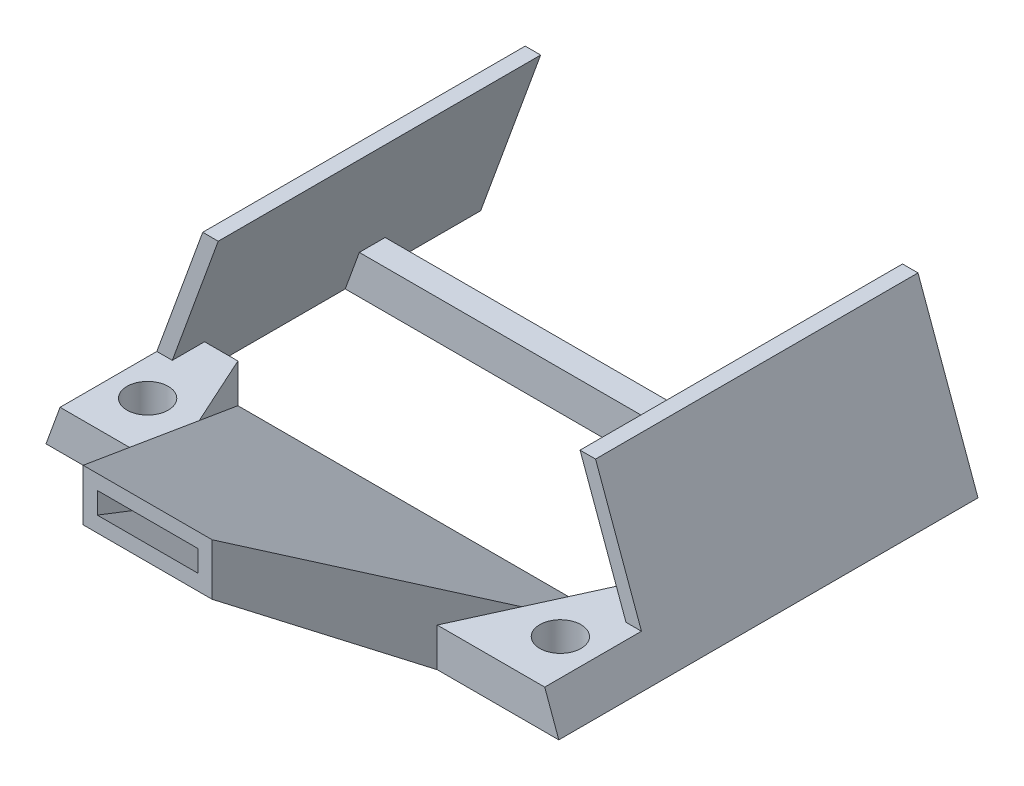
ISO-10303-21;
HEADER;
FILE_DESCRIPTION(('STEP AP214'),'2;1');
FILE_NAME('part.step','',(''),(''),'','','');
FILE_SCHEMA(('AUTOMOTIVE_DESIGN { 1 0 10303 214 1 1 1 1 }'));
ENDSEC;
DATA;
#1=APPLICATION_CONTEXT('core data for automotive mechanical design processes');
#2=APPLICATION_PROTOCOL_DEFINITION('international standard','automotive_design',2000,#1);
#3=PRODUCT_CONTEXT('',#1,'mechanical');
#4=PRODUCT('Part','Part','',(#3));
#5=PRODUCT_RELATED_PRODUCT_CATEGORY('part','',(#4));
#6=PRODUCT_DEFINITION_FORMATION('','',#4);
#7=PRODUCT_DEFINITION_CONTEXT('part definition',#1,'design');
#8=PRODUCT_DEFINITION('design','',#6,#7);
#9=PRODUCT_DEFINITION_SHAPE('','',#8);
#10=(LENGTH_UNIT() NAMED_UNIT(*) SI_UNIT(.MILLI.,.METRE.));
#11=(NAMED_UNIT(*) PLANE_ANGLE_UNIT() SI_UNIT($,.RADIAN.));
#12=(NAMED_UNIT(*) SI_UNIT($,.STERADIAN.) SOLID_ANGLE_UNIT());
#13=UNCERTAINTY_MEASURE_WITH_UNIT(LENGTH_MEASURE(1.E-05),#10,'distance_accuracy_value','');
#14=(GEOMETRIC_REPRESENTATION_CONTEXT(3) GLOBAL_UNCERTAINTY_ASSIGNED_CONTEXT((#13)) GLOBAL_UNIT_ASSIGNED_CONTEXT((#10,
#11,#12)) REPRESENTATION_CONTEXT('',''));
#15=CARTESIAN_POINT('',(0.,0.,0.));
#16=DIRECTION('',(0.,0.,1.));
#17=DIRECTION('',(1.,0.,0.));
#18=AXIS2_PLACEMENT_3D('',#15,#16,#17);
#19=CARTESIAN_POINT('',(-14.0264257375947,12.7805113490033,12.5));
#20=DIRECTION('',(-0.939692620785907,0.342020143325673,0.));
#21=DIRECTION('',(-0.342020143325673,-0.939692620785907,0.));
#22=AXIS2_PLACEMENT_3D('',#19,#20,#21);
#23=PLANE('',#22);
#24=DIRECTION('',(-0.342020143325673,-0.939692620785907,0.));
#25=VECTOR('',#24,1.);
#26=CARTESIAN_POINT('',(-14.0264257375947,12.7805113490033,-2.));
#27=LINE('',#26,#25);
#28=CARTESIAN_POINT('',(-17.5862407445347,3.,-2.));
#29=VERTEX_POINT('',#28);
#30=CARTESIAN_POINT('',(-18.6781514473333,0.,-2.));
#31=VERTEX_POINT('',#30);
#32=EDGE_CURVE('E485',#29,#31,#27,.T.);
#33=ORIENTED_EDGE('',*,*,#32,.F.);
#34=DIRECTION('',(0.,0.,-1.));
#35=VECTOR('',#34,1.);
#36=CARTESIAN_POINT('',(-17.5862407445347,3.,12.5));
#37=LINE('',#36,#35);
#38=CARTESIAN_POINT('',(-17.5862407445347,3.,-4.));
#39=VERTEX_POINT('',#38);
#40=EDGE_CURVE('E473',#29,#39,#37,.T.);
#41=ORIENTED_EDGE('',*,*,#40,.T.);
#42=DIRECTION('',(0.342020143325673,0.939692620785907,0.));
#43=VECTOR('',#42,1.);
#44=CARTESIAN_POINT('',(-14.0264257375947,12.7805113490033,-4.));
#45=LINE('',#44,#43);
#46=CARTESIAN_POINT('',(-18.6781514473333,0.,-4.));
#47=VERTEX_POINT('',#46);
#48=EDGE_CURVE('E501',#47,#39,#45,.T.);
#49=ORIENTED_EDGE('',*,*,#48,.F.);
#50=DIRECTION('',(0.,0.,-1.));
#51=VECTOR('',#50,1.);
#52=CARTESIAN_POINT('',(-18.6781514473333,0.,12.5));
#53=LINE('',#52,#51);
#54=CARTESIAN_POINT('',(-18.6781514473333,0.,-12.5));
#55=VERTEX_POINT('',#54);
#56=EDGE_CURVE('E381',#47,#55,#53,.T.);
#57=ORIENTED_EDGE('',*,*,#56,.T.);
#58=DIRECTION('',(0.342020143325673,0.939692620785907,0.));
#59=VECTOR('',#58,1.);
#60=CARTESIAN_POINT('',(-14.0264257375947,12.7805113490033,-12.5));
#61=LINE('',#60,#59);
#62=CARTESIAN_POINT('',(-14.0264257375947,12.7805113490033,-12.5));
#63=VERTEX_POINT('',#62);
#64=EDGE_CURVE('E369',#55,#63,#61,.T.);
#65=ORIENTED_EDGE('',*,*,#64,.T.);
#66=DIRECTION('',(0.,0.,-1.));
#67=VECTOR('',#66,1.);
#68=CARTESIAN_POINT('',(-14.0264257375947,12.7805113490033,12.5));
#69=LINE('',#68,#67);
#70=CARTESIAN_POINT('',(-14.0264257375947,12.7805113490033,12.5));
#71=VERTEX_POINT('',#70);
#72=EDGE_CURVE('E378',#71,#63,#69,.T.);
#73=ORIENTED_EDGE('',*,*,#72,.F.);
#74=DIRECTION('',(0.342020143325673,0.939692620785907,0.));
#75=VECTOR('',#74,1.);
#76=CARTESIAN_POINT('',(-14.0264257375947,12.7805113490033,12.5));
#77=LINE('',#76,#75);
#78=CARTESIAN_POINT('',(-17.5862407445347,3.,12.5));
#79=VERTEX_POINT('',#78);
#80=EDGE_CURVE('E360',#79,#71,#77,.T.);
#81=ORIENTED_EDGE('',*,*,#80,.F.);
#82=DIRECTION('',(0.,0.,-1.));
#83=VECTOR('',#82,1.);
#84=CARTESIAN_POINT('',(-17.5862407445347,3.,0.));
#85=LINE('',#84,#83);
#86=CARTESIAN_POINT('',(-17.5862407445347,3.,9.99999999999999));
#87=VERTEX_POINT('',#86);
#88=EDGE_CURVE('E384',#79,#87,#85,.T.);
#89=ORIENTED_EDGE('',*,*,#88,.T.);
#90=DIRECTION('',(-0.342020143325673,-0.939692620785907,0.));
#91=VECTOR('',#90,1.);
#92=CARTESIAN_POINT('',(-17.8685969399293,2.22423272891034,9.99999999999999));
#93=LINE('',#92,#91);
#94=CARTESIAN_POINT('',(-18.6781514473333,0.,9.99999999999999));
#95=VERTEX_POINT('',#94);
#96=EDGE_CURVE('E313',#87,#95,#93,.T.);
#97=ORIENTED_EDGE('',*,*,#96,.T.);
#98=EDGE_CURVE('E382',#95,#31,#53,.T.);
#99=ORIENTED_EDGE('',*,*,#98,.T.);
#100=EDGE_LOOP('',(#33,#41,#49,#57,#65,#73,#81,#89,#97,#99));
#101=FACE_BOUND('',#100,.T.);
#102=ADVANCED_FACE('F35',(#101),#23,.F.);
#103=CARTESIAN_POINT('',(-19.8781514473333,0.,12.5));
#104=DIRECTION('',(0.939692620785907,-0.342020143325673,0.));
#105=DIRECTION('',(0.342020143325673,0.939692620785907,0.));
#106=AXIS2_PLACEMENT_3D('',#103,#104,#105);
#107=PLANE('',#106);
#108=DIRECTION('',(0.,0.,-1.));
#109=VECTOR('',#108,1.);
#110=CARTESIAN_POINT('',(-18.7862407445347,3.,48.5));
#111=LINE('',#110,#109);
#112=CARTESIAN_POINT('',(-18.7862407445347,3.,20.));
#113=VERTEX_POINT('',#112);
#114=CARTESIAN_POINT('',(-18.7862407445347,3.,12.5));
#115=VERTEX_POINT('',#114);
#116=EDGE_CURVE('E216',#113,#115,#111,.T.);
#117=ORIENTED_EDGE('',*,*,#116,.T.);
#118=DIRECTION('',(-0.342020143325673,-0.939692620785907,0.));
#119=VECTOR('',#118,1.);
#120=CARTESIAN_POINT('',(-19.8781514473333,0.,12.5));
#121=LINE('',#120,#119);
#122=CARTESIAN_POINT('',(-15.2264257375947,12.7805113490033,12.5));
#123=VERTEX_POINT('',#122);
#124=EDGE_CURVE('E365',#123,#115,#121,.T.);
#125=ORIENTED_EDGE('',*,*,#124,.F.);
#126=DIRECTION('',(0.,0.,-1.));
#127=VECTOR('',#126,1.);
#128=CARTESIAN_POINT('',(-15.2264257375947,12.7805113490033,12.5));
#129=LINE('',#128,#127);
#130=CARTESIAN_POINT('',(-15.2264257375947,12.7805113490033,-12.5));
#131=VERTEX_POINT('',#130);
#132=EDGE_CURVE('E375',#123,#131,#129,.T.);
#133=ORIENTED_EDGE('',*,*,#132,.T.);
#134=DIRECTION('',(-0.342020143325673,-0.939692620785907,0.));
#135=VECTOR('',#134,1.);
#136=CARTESIAN_POINT('',(-19.8781514473333,0.,-12.5));
#137=LINE('',#136,#135);
#138=CARTESIAN_POINT('',(-19.8781514473333,0.,-12.5));
#139=VERTEX_POINT('',#138);
#140=EDGE_CURVE('E363',#131,#139,#137,.T.);
#141=ORIENTED_EDGE('',*,*,#140,.T.);
#142=DIRECTION('',(0.,0.,-1.));
#143=VECTOR('',#142,1.);
#144=CARTESIAN_POINT('',(-19.8781514473333,0.,12.5));
#145=LINE('',#144,#143);
#146=CARTESIAN_POINT('',(-19.8781514473333,0.,20.));
#147=VERTEX_POINT('',#146);
#148=EDGE_CURVE('E50',#147,#139,#145,.T.);
#149=ORIENTED_EDGE('',*,*,#148,.F.);
#150=DIRECTION('',(-0.342020143325672,-0.939692620785907,0.));
#151=VECTOR('',#150,1.);
#152=CARTESIAN_POINT('',(-17.8116175388685,5.67775525004441,20.));
#153=LINE('',#152,#151);
#154=EDGE_CURVE('E212',#113,#147,#153,.T.);
#155=ORIENTED_EDGE('',*,*,#154,.F.);
#156=EDGE_LOOP('',(#117,#125,#133,#141,#149,#155));
#157=FACE_BOUND('',#156,.T.);
#158=ADVANCED_FACE('F214',(#157),#107,.F.);
#159=CARTESIAN_POINT('',(14.0264257375947,12.7805113490033,12.5));
#160=DIRECTION('',(0.939692620785907,0.342020143325673,0.));
#161=DIRECTION('',(-0.342020143325673,0.939692620785907,0.));
#162=AXIS2_PLACEMENT_3D('',#159,#160,#161);
#163=PLANE('',#162);
#164=DIRECTION('',(-0.342020143325673,0.939692620785907,0.));
#165=VECTOR('',#164,1.);
#166=CARTESIAN_POINT('',(14.0264257375947,12.7805113490033,-2.));
#167=LINE('',#166,#165);
#168=CARTESIAN_POINT('',(18.6781514473333,0.,-2.));
#169=VERTEX_POINT('',#168);
#170=CARTESIAN_POINT('',(17.5862407445347,3.,-2.));
#171=VERTEX_POINT('',#170);
#172=EDGE_CURVE('E486',#169,#171,#167,.T.);
#173=ORIENTED_EDGE('',*,*,#172,.F.);
#174=DIRECTION('',(0.,0.,-1.));
#175=VECTOR('',#174,1.);
#176=CARTESIAN_POINT('',(18.6781514473333,0.,12.5));
#177=LINE('',#176,#175);
#178=CARTESIAN_POINT('',(18.6781514473333,0.,9.99999999999999));
#179=VERTEX_POINT('',#178);
#180=EDGE_CURVE('E329',#179,#169,#177,.T.);
#181=ORIENTED_EDGE('',*,*,#180,.F.);
#182=DIRECTION('',(-0.342020143325673,0.939692620785907,0.));
#183=VECTOR('',#182,1.);
#184=CARTESIAN_POINT('',(17.8685969399293,2.22423272891034,9.99999999999999));
#185=LINE('',#184,#183);
#186=CARTESIAN_POINT('',(17.5862407445347,3.,9.99999999999999));
#187=VERTEX_POINT('',#186);
#188=EDGE_CURVE('E43',#179,#187,#185,.T.);
#189=ORIENTED_EDGE('',*,*,#188,.T.);
#190=DIRECTION('',(0.,0.,-1.));
#191=VECTOR('',#190,1.);
#192=CARTESIAN_POINT('',(17.5862407445347,3.,0.));
#193=LINE('',#192,#191);
#194=CARTESIAN_POINT('',(17.5862407445347,3.,12.5));
#195=VERTEX_POINT('',#194);
#196=EDGE_CURVE('E326',#195,#187,#193,.T.);
#197=ORIENTED_EDGE('',*,*,#196,.F.);
#198=DIRECTION('',(0.342020143325673,-0.939692620785907,0.));
#199=VECTOR('',#198,1.);
#200=CARTESIAN_POINT('',(14.0264257375947,12.7805113490033,12.5));
#201=LINE('',#200,#199);
#202=CARTESIAN_POINT('',(14.0264257375947,12.7805113490033,12.5));
#203=VERTEX_POINT('',#202);
#204=EDGE_CURVE('E506',#203,#195,#201,.T.);
#205=ORIENTED_EDGE('',*,*,#204,.F.);
#206=DIRECTION('',(0.,0.,-1.));
#207=VECTOR('',#206,1.);
#208=CARTESIAN_POINT('',(14.0264257375947,12.7805113490033,12.5));
#209=LINE('',#208,#207);
#210=CARTESIAN_POINT('',(14.0264257375947,12.7805113490033,-12.5));
#211=VERTEX_POINT('',#210);
#212=EDGE_CURVE('E513',#203,#211,#209,.T.);
#213=ORIENTED_EDGE('',*,*,#212,.T.);
#214=DIRECTION('',(0.342020143325673,-0.939692620785907,0.));
#215=VECTOR('',#214,1.);
#216=CARTESIAN_POINT('',(14.0264257375947,12.7805113490033,-12.5));
#217=LINE('',#216,#215);
#218=CARTESIAN_POINT('',(18.6781514473333,0.,-12.5));
#219=VERTEX_POINT('',#218);
#220=EDGE_CURVE('E505',#211,#219,#217,.T.);
#221=ORIENTED_EDGE('',*,*,#220,.T.);
#222=CARTESIAN_POINT('',(18.6781514473333,0.,-4.));
#223=VERTEX_POINT('',#222);
#224=EDGE_CURVE('E529',#223,#219,#177,.T.);
#225=ORIENTED_EDGE('',*,*,#224,.F.);
#226=DIRECTION('',(0.342020143325673,-0.939692620785907,0.));
#227=VECTOR('',#226,1.);
#228=CARTESIAN_POINT('',(14.0264257375947,12.7805113490033,-4.));
#229=LINE('',#228,#227);
#230=CARTESIAN_POINT('',(17.5862407445347,3.,-4.));
#231=VERTEX_POINT('',#230);
#232=EDGE_CURVE('E481',#231,#223,#229,.T.);
#233=ORIENTED_EDGE('',*,*,#232,.F.);
#234=DIRECTION('',(0.,0.,1.));
#235=VECTOR('',#234,1.);
#236=CARTESIAN_POINT('',(17.5862407445347,3.,12.5));
#237=LINE('',#236,#235);
#238=EDGE_CURVE('E482',#231,#171,#237,.T.);
#239=ORIENTED_EDGE('',*,*,#238,.T.);
#240=EDGE_LOOP('',(#173,#181,#189,#197,#205,#213,#221,#225,#233,#239));
#241=FACE_BOUND('',#240,.T.);
#242=ADVANCED_FACE('F324',(#241),#163,.F.);
#243=CARTESIAN_POINT('',(19.8781514473333,0.,12.5));
#244=DIRECTION('',(-0.939692620785907,-0.342020143325672,0.));
#245=DIRECTION('',(0.342020143325672,-0.939692620785907,0.));
#246=AXIS2_PLACEMENT_3D('',#243,#244,#245);
#247=PLANE('',#246);
#248=DIRECTION('',(-0.342020143325672,0.939692620785907,0.));
#249=VECTOR('',#248,1.);
#250=CARTESIAN_POINT('',(19.8781514473333,0.,-12.5));
#251=LINE('',#250,#249);
#252=CARTESIAN_POINT('',(19.8781514473333,0.,-12.5));
#253=VERTEX_POINT('',#252);
#254=CARTESIAN_POINT('',(15.2264257375947,12.7805113490033,-12.5));
#255=VERTEX_POINT('',#254);
#256=EDGE_CURVE('E519',#253,#255,#251,.T.);
#257=ORIENTED_EDGE('',*,*,#256,.T.);
#258=DIRECTION('',(0.,0.,-1.));
#259=VECTOR('',#258,1.);
#260=CARTESIAN_POINT('',(15.2264257375947,12.7805113490033,12.5));
#261=LINE('',#260,#259);
#262=CARTESIAN_POINT('',(15.2264257375947,12.7805113490033,12.5));
#263=VERTEX_POINT('',#262);
#264=EDGE_CURVE('E524',#263,#255,#261,.T.);
#265=ORIENTED_EDGE('',*,*,#264,.F.);
#266=DIRECTION('',(-0.342020143325672,0.939692620785907,0.));
#267=VECTOR('',#266,1.);
#268=CARTESIAN_POINT('',(19.8781514473333,0.,12.5));
#269=LINE('',#268,#267);
#270=CARTESIAN_POINT('',(18.7862407445347,3.,12.5));
#271=VERTEX_POINT('',#270);
#272=EDGE_CURVE('E508',#271,#263,#269,.T.);
#273=ORIENTED_EDGE('',*,*,#272,.F.);
#274=DIRECTION('',(0.,0.,-1.));
#275=VECTOR('',#274,1.);
#276=CARTESIAN_POINT('',(18.7862407445347,3.,48.5));
#277=LINE('',#276,#275);
#278=CARTESIAN_POINT('',(18.7862407445347,3.,20.));
#279=VERTEX_POINT('',#278);
#280=EDGE_CURVE('E58',#279,#271,#277,.T.);
#281=ORIENTED_EDGE('',*,*,#280,.F.);
#282=DIRECTION('',(-0.342020143325672,0.939692620785907,0.));
#283=VECTOR('',#282,1.);
#284=CARTESIAN_POINT('',(17.8116175388685,5.67775525004441,20.));
#285=LINE('',#284,#283);
#286=CARTESIAN_POINT('',(19.8781514473333,0.,20.));
#287=VERTEX_POINT('',#286);
#288=EDGE_CURVE('E494',#287,#279,#285,.T.);
#289=ORIENTED_EDGE('',*,*,#288,.F.);
#290=DIRECTION('',(0.,0.,-1.));
#291=VECTOR('',#290,1.);
#292=CARTESIAN_POINT('',(19.8781514473333,0.,12.5));
#293=LINE('',#292,#291);
#294=EDGE_CURVE('E527',#287,#253,#293,.T.);
#295=ORIENTED_EDGE('',*,*,#294,.T.);
#296=EDGE_LOOP('',(#257,#265,#273,#281,#289,#295));
#297=FACE_BOUND('',#296,.T.);
#298=ADVANCED_FACE('F436',(#297),#247,.F.);
#299=CARTESIAN_POINT('',(0.,3.,0.));
#300=DIRECTION('',(0.,1.,0.));
#301=DIRECTION('',(0.,0.,1.));
#302=AXIS2_PLACEMENT_3D('',#299,#300,#301);
#303=PLANE('',#302);
#304=ORIENTED_EDGE('',*,*,#280,.T.);
#305=DIRECTION('',(1.,0.,0.));
#306=VECTOR('',#305,1.);
#307=CARTESIAN_POINT('',(0.,3.,12.5));
#308=LINE('',#307,#306);
#309=EDGE_CURVE('E11',#195,#271,#308,.T.);
#310=ORIENTED_EDGE('',*,*,#309,.F.);
#311=ORIENTED_EDGE('',*,*,#196,.T.);
#312=DIRECTION('',(-1.,0.,0.));
#313=VECTOR('',#312,1.);
#314=CARTESIAN_POINT('',(20.,3.,9.99999999999999));
#315=LINE('',#314,#313);
#316=CARTESIAN_POINT('',(15.,3.,10.));
#317=VERTEX_POINT('',#316);
#318=EDGE_CURVE('E337',#187,#317,#315,.T.);
#319=ORIENTED_EDGE('',*,*,#318,.T.);
#320=DIRECTION('',(-0.413802944301184,0.,0.910366477462605));
#321=VECTOR('',#320,1.);
#322=CARTESIAN_POINT('',(15.,3.,10.));
#323=LINE('',#322,#321);
#324=CARTESIAN_POINT('',(12.5,3.,15.5));
#325=VERTEX_POINT('',#324);
#326=EDGE_CURVE('E357',#317,#325,#323,.T.);
#327=ORIENTED_EDGE('',*,*,#326,.T.);
#328=DIRECTION('',(-0.413802944301184,0.,0.910366477462605));
#329=VECTOR('',#328,1.);
#330=CARTESIAN_POINT('',(5.00000000000001,3.,32.));
#331=LINE('',#330,#329);
#332=CARTESIAN_POINT('',(10.4545454545455,3.,20.));
#333=VERTEX_POINT('',#332);
#334=EDGE_CURVE('E317',#325,#333,#331,.T.);
#335=ORIENTED_EDGE('',*,*,#334,.T.);
#336=DIRECTION('',(1.,0.,0.));
#337=VECTOR('',#336,1.);
#338=CARTESIAN_POINT('',(10.4545454545455,3.,20.));
#339=LINE('',#338,#337);
#340=EDGE_CURVE('E344',#333,#279,#339,.T.);
#341=ORIENTED_EDGE('',*,*,#340,.T.);
#342=EDGE_LOOP('',(#304,#310,#311,#319,#327,#335,#341));
#343=FACE_BOUND('',#342,.T.);
#344=CARTESIAN_POINT('',(16.,3.,16.));
#345=DIRECTION('',(0.,1.,0.));
#346=DIRECTION('',(0.,0.,-1.));
#347=AXIS2_PLACEMENT_3D('',#344,#345,#346);
#348=CIRCLE('',#347,1.6);
#349=CARTESIAN_POINT('',(16.,3.,14.4));
#350=VERTEX_POINT('',#349);
#351=EDGE_CURVE('E350',#350,#350,#348,.T.);
#352=ORIENTED_EDGE('',*,*,#351,.F.);
#353=EDGE_LOOP('',(#352));
#354=FACE_BOUND('',#353,.T.);
#355=ADVANCED_FACE('F430',(#343,#354),#303,.T.);
#356=CARTESIAN_POINT('',(20.,3.,9.99999999999999));
#357=DIRECTION('',(0.,0.,1.));
#358=DIRECTION('',(1.,0.,0.));
#359=AXIS2_PLACEMENT_3D('',#356,#357,#358);
#360=PLANE('',#359);
#361=ORIENTED_EDGE('',*,*,#188,.F.);
#362=DIRECTION('',(-1.,0.,0.));
#363=VECTOR('',#362,1.);
#364=CARTESIAN_POINT('',(20.,0.,9.99999999999999));
#365=LINE('',#364,#363);
#366=CARTESIAN_POINT('',(15.,0.,10.));
#367=VERTEX_POINT('',#366);
#368=EDGE_CURVE('E335',#179,#367,#365,.T.);
#369=ORIENTED_EDGE('',*,*,#368,.T.);
#370=DIRECTION('',(0.,-1.,0.));
#371=VECTOR('',#370,1.);
#372=CARTESIAN_POINT('',(15.,3.,10.));
#373=LINE('',#372,#371);
#374=EDGE_CURVE('E356',#317,#367,#373,.T.);
#375=ORIENTED_EDGE('',*,*,#374,.F.);
#376=ORIENTED_EDGE('',*,*,#318,.F.);
#377=EDGE_LOOP('',(#361,#369,#375,#376));
#378=FACE_BOUND('',#377,.T.);
#379=ADVANCED_FACE('F333',(#378),#360,.F.);
#380=CARTESIAN_POINT('',(0.,3.,0.));
#381=DIRECTION('',(0.,-1.,0.));
#382=DIRECTION('',(0.,0.,-1.));
#383=AXIS2_PLACEMENT_3D('',#380,#381,#382);
#384=PLANE('',#383);
#385=CARTESIAN_POINT('',(-16.,3.,16.));
#386=DIRECTION('',(0.,1.,0.));
#387=DIRECTION('',(0.,0.,1.));
#388=AXIS2_PLACEMENT_3D('',#385,#386,#387);
#389=CIRCLE('',#388,1.6);
#390=CARTESIAN_POINT('',(-16.,3.,17.6));
#391=VERTEX_POINT('',#390);
#392=EDGE_CURVE('E250',#391,#391,#389,.T.);
#393=ORIENTED_EDGE('',*,*,#392,.F.);
#394=EDGE_LOOP('',(#393));
#395=FACE_BOUND('',#394,.T.);
#396=DIRECTION('',(1.,0.,0.));
#397=VECTOR('',#396,1.);
#398=CARTESIAN_POINT('',(0.,3.,12.5));
#399=LINE('',#398,#397);
#400=EDGE_CURVE('E228',#115,#79,#399,.T.);
#401=ORIENTED_EDGE('',*,*,#400,.F.);
#402=ORIENTED_EDGE('',*,*,#116,.F.);
#403=DIRECTION('',(1.,0.,0.));
#404=VECTOR('',#403,1.);
#405=CARTESIAN_POINT('',(-10.4545454545455,3.,20.));
#406=LINE('',#405,#404);
#407=CARTESIAN_POINT('',(-10.4545454545455,3.,20.));
#408=VERTEX_POINT('',#407);
#409=EDGE_CURVE('E225',#113,#408,#406,.T.);
#410=ORIENTED_EDGE('',*,*,#409,.T.);
#411=DIRECTION('',(-0.413802944301184,0.,-0.910366477462605));
#412=VECTOR('',#411,1.);
#413=CARTESIAN_POINT('',(-15.,3.,10.));
#414=LINE('',#413,#412);
#415=CARTESIAN_POINT('',(-12.5,3.,15.5));
#416=VERTEX_POINT('',#415);
#417=EDGE_CURVE('E238',#408,#416,#414,.T.);
#418=ORIENTED_EDGE('',*,*,#417,.T.);
#419=CARTESIAN_POINT('',(-15.,3.,10.));
#420=VERTEX_POINT('',#419);
#421=EDGE_CURVE('E235',#416,#420,#414,.T.);
#422=ORIENTED_EDGE('',*,*,#421,.T.);
#423=DIRECTION('',(-1.,0.,0.));
#424=VECTOR('',#423,1.);
#425=CARTESIAN_POINT('',(-20.,3.,9.99999999999999));
#426=LINE('',#425,#424);
#427=EDGE_CURVE('E246',#420,#87,#426,.T.);
#428=ORIENTED_EDGE('',*,*,#427,.T.);
#429=ORIENTED_EDGE('',*,*,#88,.F.);
#430=EDGE_LOOP('',(#401,#402,#410,#418,#422,#428,#429));
#431=FACE_BOUND('',#430,.T.);
#432=ADVANCED_FACE('F223',(#395,#431),#384,.F.);
#433=CARTESIAN_POINT('',(-20.,3.,9.99999999999999));
#434=DIRECTION('',(0.,0.,1.));
#435=DIRECTION('',(1.,0.,0.));
#436=AXIS2_PLACEMENT_3D('',#433,#434,#435);
#437=PLANE('',#436);
#438=ORIENTED_EDGE('',*,*,#96,.F.);
#439=ORIENTED_EDGE('',*,*,#427,.F.);
#440=DIRECTION('',(0.,-1.,0.));
#441=VECTOR('',#440,1.);
#442=CARTESIAN_POINT('',(-15.,3.,10.));
#443=LINE('',#442,#441);
#444=CARTESIAN_POINT('',(-15.,0.,10.));
#445=VERTEX_POINT('',#444);
#446=EDGE_CURVE('E249',#420,#445,#443,.T.);
#447=ORIENTED_EDGE('',*,*,#446,.T.);
#448=DIRECTION('',(-1.,0.,0.));
#449=VECTOR('',#448,1.);
#450=CARTESIAN_POINT('',(-20.,0.,9.99999999999999));
#451=LINE('',#450,#449);
#452=EDGE_CURVE('E236',#445,#95,#451,.T.);
#453=ORIENTED_EDGE('',*,*,#452,.T.);
#454=EDGE_LOOP('',(#438,#439,#447,#453));
#455=FACE_BOUND('',#454,.T.);
#456=ADVANCED_FACE('F585',(#455),#437,.F.);
#457=CARTESIAN_POINT('',(-5.,30.,32.));
#458=DIRECTION('',(-0.910366477462605,0.,0.413802944301184));
#459=DIRECTION('',(0.413802944301184,0.,0.910366477462605));
#460=AXIS2_PLACEMENT_3D('',#457,#458,#459);
#461=PLANE('',#460);
#462=DIRECTION('',(-0.370624658330551,-0.44474958999666,-0.815374248327212));
#463=VECTOR('',#462,1.);
#464=CARTESIAN_POINT('',(-2.25274725274725,15.2967032967033,38.0439560439561));
#465=LINE('',#464,#463);
#466=CARTESIAN_POINT('',(-5.,12.,32.));
#467=VERTEX_POINT('',#466);
#468=EDGE_CURVE('E297',#467,#416,#465,.T.);
#469=ORIENTED_EDGE('',*,*,#468,.T.);
#470=ORIENTED_EDGE('',*,*,#417,.F.);
#471=DIRECTION('',(0.,-1.,0.));
#472=VECTOR('',#471,1.);
#473=CARTESIAN_POINT('',(-10.4545454545455,3.,20.));
#474=LINE('',#473,#472);
#475=CARTESIAN_POINT('',(-10.4545454545455,0.,20.));
#476=VERTEX_POINT('',#475);
#477=EDGE_CURVE('E233',#408,#476,#474,.T.);
#478=ORIENTED_EDGE('',*,*,#477,.T.);
#479=DIRECTION('',(0.353749972977434,0.518833293700236,0.778249940550354));
#480=VECTOR('',#479,1.);
#481=CARTESIAN_POINT('',(-7.26918798665184,4.6718576195773,27.007786429366));
#482=LINE('',#481,#480);
#483=CARTESIAN_POINT('',(-5.,8.,32.));
#484=VERTEX_POINT('',#483);
#485=EDGE_CURVE('E300',#476,#484,#482,.T.);
#486=ORIENTED_EDGE('',*,*,#485,.T.);
#487=DIRECTION('',(0.,-1.,0.));
#488=VECTOR('',#487,1.);
#489=CARTESIAN_POINT('',(-5.,30.,32.));
#490=LINE('',#489,#488);
#491=EDGE_CURVE('E293',#467,#484,#490,.T.);
#492=ORIENTED_EDGE('',*,*,#491,.F.);
#493=EDGE_LOOP('',(#469,#470,#478,#486,#492));
#494=FACE_BOUND('',#493,.T.);
#495=ADVANCED_FACE('F557',(#494),#461,.T.);
#496=CARTESIAN_POINT('',(15.,0.,20.));
#497=DIRECTION('',(0.,1.,0.));
#498=DIRECTION('',(0.,0.,1.));
#499=AXIS2_PLACEMENT_3D('',#496,#497,#498);
#500=PLANE('',#499);
#501=ORIENTED_EDGE('',*,*,#180,.T.);
#502=DIRECTION('',(1.,0.,0.));
#503=VECTOR('',#502,1.);
#504=CARTESIAN_POINT('',(-20.,0.,-2.));
#505=LINE('',#504,#503);
#506=EDGE_CURVE('E491',#31,#169,#505,.T.);
#507=ORIENTED_EDGE('',*,*,#506,.F.);
#508=ORIENTED_EDGE('',*,*,#98,.F.);
#509=ORIENTED_EDGE('',*,*,#452,.F.);
#510=DIRECTION('',(-1.,0.,0.));
#511=VECTOR('',#510,1.);
#512=CARTESIAN_POINT('',(15.,0.,10.));
#513=LINE('',#512,#511);
#514=EDGE_CURVE('E307',#367,#445,#513,.T.);
#515=ORIENTED_EDGE('',*,*,#514,.F.);
#516=ORIENTED_EDGE('',*,*,#368,.F.);
#517=EDGE_LOOP('',(#501,#507,#508,#509,#515,#516));
#518=FACE_BOUND('',#517,.T.);
#519=DIRECTION('',(1.,0.,0.));
#520=VECTOR('',#519,1.);
#521=CARTESIAN_POINT('',(-10.4545454545455,0.,20.));
#522=LINE('',#521,#520);
#523=EDGE_CURVE('E240',#147,#476,#522,.T.);
#524=ORIENTED_EDGE('',*,*,#523,.F.);
#525=ORIENTED_EDGE('',*,*,#148,.T.);
#526=DIRECTION('',(1.,0.,0.));
#527=VECTOR('',#526,1.);
#528=CARTESIAN_POINT('',(-18.6781514473333,0.,-12.5));
#529=LINE('',#528,#527);
#530=EDGE_CURVE('E359',#139,#55,#529,.T.);
#531=ORIENTED_EDGE('',*,*,#530,.T.);
#532=ORIENTED_EDGE('',*,*,#56,.F.);
#533=DIRECTION('',(-1.,0.,0.));
#534=VECTOR('',#533,1.);
#535=CARTESIAN_POINT('',(-20.,0.,-4.));
#536=LINE('',#535,#534);
#537=EDGE_CURVE('E487',#223,#47,#536,.T.);
#538=ORIENTED_EDGE('',*,*,#537,.F.);
#539=ORIENTED_EDGE('',*,*,#224,.T.);
#540=DIRECTION('',(1.,0.,0.));
#541=VECTOR('',#540,1.);
#542=CARTESIAN_POINT('',(18.6781514473333,0.,-12.5));
#543=LINE('',#542,#541);
#544=EDGE_CURVE('E516',#219,#253,#543,.T.);
#545=ORIENTED_EDGE('',*,*,#544,.T.);
#546=ORIENTED_EDGE('',*,*,#294,.F.);
#547=DIRECTION('',(1.,0.,0.));
#548=VECTOR('',#547,1.);
#549=CARTESIAN_POINT('',(10.4545454545455,0.,20.));
#550=LINE('',#549,#548);
#551=CARTESIAN_POINT('',(10.4545454545455,0.,20.));
#552=VERTEX_POINT('',#551);
#553=EDGE_CURVE('E345',#552,#287,#550,.T.);
#554=ORIENTED_EDGE('',*,*,#553,.F.);
#555=DIRECTION('',(-1.,0.,0.));
#556=VECTOR('',#555,1.);
#557=CARTESIAN_POINT('',(15.,0.,20.));
#558=LINE('',#557,#556);
#559=EDGE_CURVE('E310',#552,#476,#558,.T.);
#560=ORIENTED_EDGE('',*,*,#559,.T.);
#561=EDGE_LOOP('',(#524,#525,#531,#532,#538,#539,#545,#546,#554,#560));
#562=FACE_BOUND('',#561,.T.);
#563=CARTESIAN_POINT('',(16.,0.,16.));
#564=DIRECTION('',(0.,1.,0.));
#565=DIRECTION('',(0.,0.,-1.));
#566=AXIS2_PLACEMENT_3D('',#563,#564,#565);
#567=CIRCLE('',#566,1.6);
#568=CARTESIAN_POINT('',(16.,0.,14.4));
#569=VERTEX_POINT('',#568);
#570=EDGE_CURVE('E532',#569,#569,#567,.T.);
#571=ORIENTED_EDGE('',*,*,#570,.T.);
#572=EDGE_LOOP('',(#571));
#573=FACE_BOUND('',#572,.T.);
#574=DIRECTION('',(-0.413802944301184,0.,0.910366477462605));
#575=VECTOR('',#574,1.);
#576=CARTESIAN_POINT('',(4.0896335225374,0.,31.5861970556988));
#577=LINE('',#576,#575);
#578=CARTESIAN_POINT('',(12.9523015716322,0.,12.0883273476903));
#579=VERTEX_POINT('',#578);
#580=CARTESIAN_POINT('',(10.1755302013696,0.,18.197224362268));
#581=VERTEX_POINT('',#580);
#582=EDGE_CURVE('E255',#579,#581,#577,.T.);
#583=ORIENTED_EDGE('',*,*,#582,.F.);
#584=DIRECTION('',(-1.,0.,0.));
#585=VECTOR('',#584,1.);
#586=CARTESIAN_POINT('',(15.,0.,12.0883273476903));
#587=LINE('',#586,#585);
#588=CARTESIAN_POINT('',(-12.9523015716322,0.,12.0883273476903));
#589=VERTEX_POINT('',#588);
#590=EDGE_CURVE('E276',#579,#589,#587,.T.);
#591=ORIENTED_EDGE('',*,*,#590,.T.);
#592=DIRECTION('',(-0.413802944301184,0.,-0.910366477462605));
#593=VECTOR('',#592,1.);
#594=CARTESIAN_POINT('',(-4.0896335225374,0.,31.5861970556988));
#595=LINE('',#594,#593);
#596=CARTESIAN_POINT('',(-10.1755302013696,0.,18.197224362268));
#597=VERTEX_POINT('',#596);
#598=EDGE_CURVE('E258',#597,#589,#595,.T.);
#599=ORIENTED_EDGE('',*,*,#598,.F.);
#600=DIRECTION('',(-1.,0.,0.));
#601=VECTOR('',#600,1.);
#602=CARTESIAN_POINT('',(15.,0.,18.197224362268));
#603=LINE('',#602,#601);
#604=EDGE_CURVE('E278',#581,#597,#603,.T.);
#605=ORIENTED_EDGE('',*,*,#604,.F.);
#606=EDGE_LOOP('',(#583,#591,#599,#605));
#607=FACE_BOUND('',#606,.T.);
#608=CARTESIAN_POINT('',(-16.,0.,16.));
#609=DIRECTION('',(0.,1.,0.));
#610=DIRECTION('',(0.,0.,1.));
#611=AXIS2_PLACEMENT_3D('',#608,#609,#610);
#612=CIRCLE('',#611,1.6);
#613=CARTESIAN_POINT('',(-16.,0.,17.6));
#614=VERTEX_POINT('',#613);
#615=EDGE_CURVE('E243',#614,#614,#612,.T.);
#616=ORIENTED_EDGE('',*,*,#615,.T.);
#617=EDGE_LOOP('',(#616));
#618=FACE_BOUND('',#617,.T.);
#619=ADVANCED_FACE('F340',(#518,#562,#573,#607,#618),#500,.F.);
#620=CARTESIAN_POINT('',(15.,0.,20.));
#621=DIRECTION('',(0.,0.832050294337844,-0.554700196225229));
#622=DIRECTION('',(0.,0.554700196225229,0.832050294337844));
#623=AXIS2_PLACEMENT_3D('',#620,#621,#622);
#624=PLANE('',#623);
#625=DIRECTION('',(0.353749972977433,-0.518833293700236,-0.778249940550354));
#626=VECTOR('',#625,1.);
#627=CARTESIAN_POINT('',(11.0233592880979,-0.834260289210231,18.7486095661846));
#628=LINE('',#627,#626);
#629=CARTESIAN_POINT('',(5.00000000000001,8.,32.));
#630=VERTEX_POINT('',#629);
#631=EDGE_CURVE('E290',#630,#552,#628,.T.);
#632=ORIENTED_EDGE('',*,*,#631,.F.);
#633=DIRECTION('',(-1.,0.,0.));
#634=VECTOR('',#633,1.);
#635=CARTESIAN_POINT('',(15.,8.,32.));
#636=LINE('',#635,#634);
#637=EDGE_CURVE('E303',#630,#484,#636,.T.);
#638=ORIENTED_EDGE('',*,*,#637,.T.);
#639=ORIENTED_EDGE('',*,*,#485,.F.);
#640=ORIENTED_EDGE('',*,*,#559,.F.);
#641=EDGE_LOOP('',(#632,#638,#639,#640));
#642=FACE_BOUND('',#641,.T.);
#643=ADVANCED_FACE('F37',(#642),#624,.F.);
#644=CARTESIAN_POINT('',(15.,12.,32.));
#645=DIRECTION('',(0.,-0.877895572914384,0.478852130680573));
#646=DIRECTION('',(0.,-0.478852130680573,-0.877895572914385));
#647=AXIS2_PLACEMENT_3D('',#644,#645,#646);
#648=PLANE('',#647);
#649=DIRECTION('',(-0.37062465833055,0.44474958999666,0.815374248327212));
#650=VECTOR('',#649,1.);
#651=CARTESIAN_POINT('',(6.37362637362638,10.3516483516484,28.978021978022));
#652=LINE('',#651,#650);
#653=EDGE_CURVE('E288',#367,#325,#652,.T.);
#654=ORIENTED_EDGE('',*,*,#653,.F.);
#655=ORIENTED_EDGE('',*,*,#514,.T.);
#656=EDGE_CURVE('E296',#416,#445,#465,.T.);
#657=ORIENTED_EDGE('',*,*,#656,.F.);
#658=ORIENTED_EDGE('',*,*,#468,.F.);
#659=DIRECTION('',(-1.,0.,0.));
#660=VECTOR('',#659,1.);
#661=CARTESIAN_POINT('',(15.,12.,32.));
#662=LINE('',#661,#660);
#663=CARTESIAN_POINT('',(5.00000000000001,12.,32.));
#664=VERTEX_POINT('',#663);
#665=EDGE_CURVE('E305',#664,#467,#662,.T.);
#666=ORIENTED_EDGE('',*,*,#665,.F.);
#667=EDGE_CURVE('E287',#325,#664,#652,.T.);
#668=ORIENTED_EDGE('',*,*,#667,.F.);
#669=EDGE_LOOP('',(#654,#655,#657,#658,#666,#668));
#670=FACE_BOUND('',#669,.T.);
#671=ADVANCED_FACE('F549',(#670),#648,.F.);
#672=CARTESIAN_POINT('',(15.,8.,32.));
#673=DIRECTION('',(0.,0.,-1.));
#674=DIRECTION('',(-1.,0.,0.));
#675=AXIS2_PLACEMENT_3D('',#672,#673,#674);
#676=PLANE('',#675);
#677=DIRECTION('',(-1.,0.,0.));
#678=VECTOR('',#677,1.);
#679=CARTESIAN_POINT('',(15.,10.8609123558053,32.));
#680=LINE('',#679,#678);
#681=CARTESIAN_POINT('',(3.90154127512777,10.8609123558053,32.));
#682=VERTEX_POINT('',#681);
#683=CARTESIAN_POINT('',(-3.90154127512777,10.8609123558053,32.));
#684=VERTEX_POINT('',#683);
#685=EDGE_CURVE('E272',#682,#684,#680,.T.);
#686=ORIENTED_EDGE('',*,*,#685,.F.);
#687=DIRECTION('',(0.,-1.,0.));
#688=VECTOR('',#687,1.);
#689=CARTESIAN_POINT('',(3.90154127512777,8.,32.));
#690=LINE('',#689,#688);
#691=CARTESIAN_POINT('',(3.90154127512777,9.20185042515466,32.));
#692=VERTEX_POINT('',#691);
#693=EDGE_CURVE('E269',#682,#692,#690,.T.);
#694=ORIENTED_EDGE('',*,*,#693,.T.);
#695=DIRECTION('',(-1.,0.,0.));
#696=VECTOR('',#695,1.);
#697=CARTESIAN_POINT('',(15.,9.20185042515466,32.));
#698=LINE('',#697,#696);
#699=CARTESIAN_POINT('',(-3.90154127512777,9.20185042515466,32.));
#700=VERTEX_POINT('',#699);
#701=EDGE_CURVE('E263',#692,#700,#698,.T.);
#702=ORIENTED_EDGE('',*,*,#701,.T.);
#703=DIRECTION('',(0.,-1.,0.));
#704=VECTOR('',#703,1.);
#705=CARTESIAN_POINT('',(-3.90154127512777,30.,32.));
#706=LINE('',#705,#704);
#707=EDGE_CURVE('E267',#684,#700,#706,.T.);
#708=ORIENTED_EDGE('',*,*,#707,.F.);
#709=EDGE_LOOP('',(#686,#694,#702,#708));
#710=FACE_BOUND('',#709,.T.);
#711=DIRECTION('',(0.,-1.,0.));
#712=VECTOR('',#711,1.);
#713=CARTESIAN_POINT('',(5.00000000000001,30.,32.));
#714=LINE('',#713,#712);
#715=EDGE_CURVE('E280',#664,#630,#714,.T.);
#716=ORIENTED_EDGE('',*,*,#715,.F.);
#717=ORIENTED_EDGE('',*,*,#665,.T.);
#718=ORIENTED_EDGE('',*,*,#491,.T.);
#719=ORIENTED_EDGE('',*,*,#637,.F.);
#720=EDGE_LOOP('',(#716,#717,#718,#719));
#721=FACE_BOUND('',#720,.T.);
#722=ADVANCED_FACE('F554',(#710,#721),#676,.F.);
#723=CARTESIAN_POINT('',(5.00000000000001,30.,32.));
#724=DIRECTION('',(0.910366477462605,0.,0.413802944301183));
#725=DIRECTION('',(0.413802944301184,0.,-0.910366477462605));
#726=AXIS2_PLACEMENT_3D('',#723,#724,#725);
#727=PLANE('',#726);
#728=ORIENTED_EDGE('',*,*,#334,.F.);
#729=ORIENTED_EDGE('',*,*,#667,.T.);
#730=ORIENTED_EDGE('',*,*,#715,.T.);
#731=ORIENTED_EDGE('',*,*,#631,.T.);
#732=DIRECTION('',(0.,-1.,0.));
#733=VECTOR('',#732,1.);
#734=CARTESIAN_POINT('',(10.4545454545455,3.,20.));
#735=LINE('',#734,#733);
#736=EDGE_CURVE('E354',#333,#552,#735,.T.);
#737=ORIENTED_EDGE('',*,*,#736,.F.);
#738=EDGE_LOOP('',(#728,#729,#730,#731,#737));
#739=FACE_BOUND('',#738,.T.);
#740=ADVANCED_FACE('F544',(#739),#727,.T.);
#741=CARTESIAN_POINT('',(15.,0.832050294337844,19.4452998037748));
#742=DIRECTION('',(0.,0.832050294337844,-0.554700196225229));
#743=DIRECTION('',(0.,0.554700196225229,0.832050294337844));
#744=AXIS2_PLACEMENT_3D('',#741,#742,#743);
#745=PLANE('',#744);
#746=DIRECTION('',(0.353749972977433,-0.518833293700236,-0.778249940550354));
#747=VECTOR('',#746,1.);
#748=CARTESIAN_POINT('',(10.2829449755712,-0.157541668829035,17.9609118590244));
#749=LINE('',#748,#747);
#750=EDGE_CURVE('E256',#692,#581,#749,.T.);
#751=ORIENTED_EDGE('',*,*,#750,.T.);
#752=ORIENTED_EDGE('',*,*,#604,.T.);
#753=DIRECTION('',(0.353749972977434,0.518833293700236,0.778249940550354));
#754=VECTOR('',#753,1.);
#755=CARTESIAN_POINT('',(-6.52877367412515,5.3485762399585,26.2200887222058));
#756=LINE('',#755,#754);
#757=EDGE_CURVE('E260',#597,#700,#756,.T.);
#758=ORIENTED_EDGE('',*,*,#757,.T.);
#759=ORIENTED_EDGE('',*,*,#701,.F.);
#760=EDGE_LOOP('',(#751,#752,#758,#759));
#761=FACE_BOUND('',#760,.T.);
#762=ADVANCED_FACE('F598',(#761),#745,.T.);
#763=CARTESIAN_POINT('',(15.,11.1221044270856,32.4788521306806));
#764=DIRECTION('',(0.,-0.877895572914384,0.478852130680573));
#765=DIRECTION('',(0.,-0.478852130680573,-0.877895572914385));
#766=AXIS2_PLACEMENT_3D('',#763,#764,#765);
#767=PLANE('',#766);
#768=DIRECTION('',(-0.37062465833055,0.44474958999666,0.815374248327212));
#769=VECTOR('',#768,1.);
#770=CARTESIAN_POINT('',(5.23829313664406,9.25681012198576,29.0591459046642));
#771=LINE('',#770,#769);
#772=EDGE_CURVE('E259',#579,#682,#771,.T.);
#773=ORIENTED_EDGE('',*,*,#772,.T.);
#774=ORIENTED_EDGE('',*,*,#685,.T.);
#775=DIRECTION('',(-0.370624658330551,-0.44474958999666,-0.815374248327212));
#776=VECTOR('',#775,1.);
#777=CARTESIAN_POINT('',(-1.11741401576494,14.2018650670407,38.1250799705982));
#778=LINE('',#777,#776);
#779=EDGE_CURVE('E264',#684,#589,#778,.T.);
#780=ORIENTED_EDGE('',*,*,#779,.T.);
#781=ORIENTED_EDGE('',*,*,#590,.F.);
#782=EDGE_LOOP('',(#773,#774,#780,#781));
#783=FACE_BOUND('',#782,.T.);
#784=ADVANCED_FACE('F601',(#783),#767,.T.);
#785=CARTESIAN_POINT('',(-4.08963352253739,30.,31.5861970556988));
#786=DIRECTION('',(-0.910366477462605,0.,0.413802944301184));
#787=DIRECTION('',(0.413802944301184,0.,0.910366477462605));
#788=AXIS2_PLACEMENT_3D('',#785,#786,#787);
#789=PLANE('',#788);
#790=ORIENTED_EDGE('',*,*,#757,.F.);
#791=ORIENTED_EDGE('',*,*,#598,.T.);
#792=ORIENTED_EDGE('',*,*,#779,.F.);
#793=ORIENTED_EDGE('',*,*,#707,.T.);
#794=EDGE_LOOP('',(#790,#791,#792,#793));
#795=FACE_BOUND('',#794,.T.);
#796=ADVANCED_FACE('F593',(#795),#789,.F.);
#797=CARTESIAN_POINT('',(4.0896335225374,30.,31.5861970556988));
#798=DIRECTION('',(0.910366477462605,0.,0.413802944301183));
#799=DIRECTION('',(0.413802944301184,0.,-0.910366477462605));
#800=AXIS2_PLACEMENT_3D('',#797,#798,#799);
#801=PLANE('',#800);
#802=ORIENTED_EDGE('',*,*,#750,.F.);
#803=ORIENTED_EDGE('',*,*,#693,.F.);
#804=ORIENTED_EDGE('',*,*,#772,.F.);
#805=ORIENTED_EDGE('',*,*,#582,.T.);
#806=EDGE_LOOP('',(#802,#803,#804,#805));
#807=FACE_BOUND('',#806,.T.);
#808=ADVANCED_FACE('F588',(#807),#801,.F.);
#809=CARTESIAN_POINT('',(-15.,3.,10.));
#810=DIRECTION('',(-0.910366477462605,0.,0.413802944301184));
#811=DIRECTION('',(0.413802944301184,0.,0.910366477462605));
#812=AXIS2_PLACEMENT_3D('',#809,#810,#811);
#813=PLANE('',#812);
#814=ORIENTED_EDGE('',*,*,#421,.F.);
#815=ORIENTED_EDGE('',*,*,#656,.T.);
#816=ORIENTED_EDGE('',*,*,#446,.F.);
#817=EDGE_LOOP('',(#814,#815,#816));
#818=FACE_BOUND('',#817,.T.);
#819=ADVANCED_FACE('F404',(#818),#813,.F.);
#820=CARTESIAN_POINT('',(-10.4545454545455,3.,20.));
#821=DIRECTION('',(0.,0.,-1.));
#822=DIRECTION('',(-1.,0.,0.));
#823=AXIS2_PLACEMENT_3D('',#820,#821,#822);
#824=PLANE('',#823);
#825=ORIENTED_EDGE('',*,*,#409,.F.);
#826=ORIENTED_EDGE('',*,*,#154,.T.);
#827=ORIENTED_EDGE('',*,*,#523,.T.);
#828=ORIENTED_EDGE('',*,*,#477,.F.);
#829=EDGE_LOOP('',(#825,#826,#827,#828));
#830=FACE_BOUND('',#829,.T.);
#831=ADVANCED_FACE('F231',(#830),#824,.F.);
#832=CARTESIAN_POINT('',(-16.,3.,16.));
#833=DIRECTION('',(0.,-1.,0.));
#834=DIRECTION('',(0.,0.,-1.));
#835=AXIS2_PLACEMENT_3D('',#832,#833,#834);
#836=CYLINDRICAL_SURFACE('',#835,1.6);
#837=ORIENTED_EDGE('',*,*,#392,.T.);
#838=EDGE_LOOP('',(#837));
#839=FACE_BOUND('',#838,.T.);
#840=ORIENTED_EDGE('',*,*,#615,.F.);
#841=EDGE_LOOP('',(#840));
#842=FACE_BOUND('',#841,.T.);
#843=ADVANCED_FACE('F393',(#839,#842),#836,.F.);
#844=CARTESIAN_POINT('',(0.,0.,12.5));
#845=DIRECTION('',(0.,0.,-1.));
#846=DIRECTION('',(-1.,0.,0.));
#847=AXIS2_PLACEMENT_3D('',#844,#845,#846);
#848=PLANE('',#847);
#849=ORIENTED_EDGE('',*,*,#124,.T.);
#850=ORIENTED_EDGE('',*,*,#400,.T.);
#851=ORIENTED_EDGE('',*,*,#80,.T.);
#852=DIRECTION('',(-1.,0.,0.));
#853=VECTOR('',#852,1.);
#854=CARTESIAN_POINT('',(-15.2264257375947,12.7805113490033,12.5));
#855=LINE('',#854,#853);
#856=EDGE_CURVE('E362',#71,#123,#855,.T.);
#857=ORIENTED_EDGE('',*,*,#856,.T.);
#858=EDGE_LOOP('',(#849,#850,#851,#857));
#859=FACE_BOUND('',#858,.T.);
#860=ADVANCED_FACE('F395',(#859),#848,.F.);
#861=CARTESIAN_POINT('',(-15.2264257375947,12.7805113490033,12.5));
#862=DIRECTION('',(0.,-1.,0.));
#863=DIRECTION('',(1.,0.,0.));
#864=AXIS2_PLACEMENT_3D('',#861,#862,#863);
#865=PLANE('',#864);
#866=DIRECTION('',(-1.,0.,0.));
#867=VECTOR('',#866,1.);
#868=CARTESIAN_POINT('',(-15.2264257375947,12.7805113490033,-12.5));
#869=LINE('',#868,#867);
#870=EDGE_CURVE('E371',#63,#131,#869,.T.);
#871=ORIENTED_EDGE('',*,*,#870,.T.);
#872=ORIENTED_EDGE('',*,*,#132,.F.);
#873=ORIENTED_EDGE('',*,*,#856,.F.);
#874=ORIENTED_EDGE('',*,*,#72,.T.);
#875=EDGE_LOOP('',(#871,#872,#873,#874));
#876=FACE_BOUND('',#875,.T.);
#877=ADVANCED_FACE('F401',(#876),#865,.F.);
#878=CARTESIAN_POINT('',(0.,0.,-12.5));
#879=DIRECTION('',(0.,0.,-1.));
#880=DIRECTION('',(-1.,0.,0.));
#881=AXIS2_PLACEMENT_3D('',#878,#879,#880);
#882=PLANE('',#881);
#883=ORIENTED_EDGE('',*,*,#530,.F.);
#884=ORIENTED_EDGE('',*,*,#140,.F.);
#885=ORIENTED_EDGE('',*,*,#870,.F.);
#886=ORIENTED_EDGE('',*,*,#64,.F.);
#887=EDGE_LOOP('',(#883,#884,#885,#886));
#888=FACE_BOUND('',#887,.T.);
#889=ADVANCED_FACE('F416',(#888),#882,.T.);
#890=CARTESIAN_POINT('',(15.,3.,10.));
#891=DIRECTION('',(0.910366477462605,0.,0.413802944301184));
#892=DIRECTION('',(0.413802944301184,0.,-0.910366477462605));
#893=AXIS2_PLACEMENT_3D('',#890,#891,#892);
#894=PLANE('',#893);
#895=ORIENTED_EDGE('',*,*,#374,.T.);
#896=ORIENTED_EDGE('',*,*,#653,.T.);
#897=ORIENTED_EDGE('',*,*,#326,.F.);
#898=EDGE_LOOP('',(#895,#896,#897));
#899=FACE_BOUND('',#898,.T.);
#900=ADVANCED_FACE('F420',(#899),#894,.F.);
#901=CARTESIAN_POINT('',(10.4545454545455,3.,20.));
#902=DIRECTION('',(0.,0.,-1.));
#903=DIRECTION('',(-1.,0.,0.));
#904=AXIS2_PLACEMENT_3D('',#901,#902,#903);
#905=PLANE('',#904);
#906=ORIENTED_EDGE('',*,*,#553,.T.);
#907=ORIENTED_EDGE('',*,*,#288,.T.);
#908=ORIENTED_EDGE('',*,*,#340,.F.);
#909=ORIENTED_EDGE('',*,*,#736,.T.);
#910=EDGE_LOOP('',(#906,#907,#908,#909));
#911=FACE_BOUND('',#910,.T.);
#912=ADVANCED_FACE('F423',(#911),#905,.F.);
#913=CARTESIAN_POINT('',(16.,3.,16.));
#914=DIRECTION('',(0.,-1.,0.));
#915=DIRECTION('',(0.,0.,-1.));
#916=AXIS2_PLACEMENT_3D('',#913,#914,#915);
#917=CYLINDRICAL_SURFACE('',#916,1.6);
#918=ORIENTED_EDGE('',*,*,#351,.T.);
#919=EDGE_LOOP('',(#918));
#920=FACE_BOUND('',#919,.T.);
#921=ORIENTED_EDGE('',*,*,#570,.F.);
#922=EDGE_LOOP('',(#921));
#923=FACE_BOUND('',#922,.T.);
#924=ADVANCED_FACE('F426',(#920,#923),#917,.F.);
#925=CARTESIAN_POINT('',(15.2264257375947,12.7805113490033,12.5));
#926=DIRECTION('',(0.,-1.,0.));
#927=DIRECTION('',(1.,0.,0.));
#928=AXIS2_PLACEMENT_3D('',#925,#926,#927);
#929=PLANE('',#928);
#930=DIRECTION('',(-1.,0.,0.));
#931=VECTOR('',#930,1.);
#932=CARTESIAN_POINT('',(15.2264257375947,12.7805113490033,-12.5));
#933=LINE('',#932,#931);
#934=EDGE_CURVE('E509',#255,#211,#933,.T.);
#935=ORIENTED_EDGE('',*,*,#934,.T.);
#936=ORIENTED_EDGE('',*,*,#212,.F.);
#937=DIRECTION('',(-1.,0.,0.));
#938=VECTOR('',#937,1.);
#939=CARTESIAN_POINT('',(15.2264257375947,12.7805113490033,12.5));
#940=LINE('',#939,#938);
#941=EDGE_CURVE('E511',#263,#203,#940,.T.);
#942=ORIENTED_EDGE('',*,*,#941,.F.);
#943=ORIENTED_EDGE('',*,*,#264,.T.);
#944=EDGE_LOOP('',(#935,#936,#942,#943));
#945=FACE_BOUND('',#944,.T.);
#946=ADVANCED_FACE('F440',(#945),#929,.F.);
#947=CARTESIAN_POINT('',(0.,0.,12.5));
#948=DIRECTION('',(0.,0.,1.));
#949=DIRECTION('',(1.,0.,0.));
#950=AXIS2_PLACEMENT_3D('',#947,#948,#949);
#951=PLANE('',#950);
#952=ORIENTED_EDGE('',*,*,#204,.T.);
#953=ORIENTED_EDGE('',*,*,#309,.T.);
#954=ORIENTED_EDGE('',*,*,#272,.T.);
#955=ORIENTED_EDGE('',*,*,#941,.T.);
#956=EDGE_LOOP('',(#952,#953,#954,#955));
#957=FACE_BOUND('',#956,.T.);
#958=ADVANCED_FACE('F448',(#957),#951,.T.);
#959=CARTESIAN_POINT('',(0.,0.,-12.5));
#960=DIRECTION('',(0.,0.,1.));
#961=DIRECTION('',(1.,0.,0.));
#962=AXIS2_PLACEMENT_3D('',#959,#960,#961);
#963=PLANE('',#962);
#964=ORIENTED_EDGE('',*,*,#220,.F.);
#965=ORIENTED_EDGE('',*,*,#934,.F.);
#966=ORIENTED_EDGE('',*,*,#256,.F.);
#967=ORIENTED_EDGE('',*,*,#544,.F.);
#968=EDGE_LOOP('',(#964,#965,#966,#967));
#969=FACE_BOUND('',#968,.T.);
#970=ADVANCED_FACE('F450',(#969),#963,.F.);
#971=CARTESIAN_POINT('',(0.,3.,0.));
#972=DIRECTION('',(0.,1.,0.));
#973=DIRECTION('',(0.,0.,1.));
#974=AXIS2_PLACEMENT_3D('',#971,#972,#973);
#975=PLANE('',#974);
#976=ORIENTED_EDGE('',*,*,#40,.F.);
#977=DIRECTION('',(1.,0.,0.));
#978=VECTOR('',#977,1.);
#979=CARTESIAN_POINT('',(-20.,3.,-2.));
#980=LINE('',#979,#978);
#981=EDGE_CURVE('E475',#29,#171,#980,.T.);
#982=ORIENTED_EDGE('',*,*,#981,.T.);
#983=ORIENTED_EDGE('',*,*,#238,.F.);
#984=DIRECTION('',(-1.,0.,0.));
#985=VECTOR('',#984,1.);
#986=CARTESIAN_POINT('',(-20.,3.,-4.));
#987=LINE('',#986,#985);
#988=EDGE_CURVE('E478',#231,#39,#987,.T.);
#989=ORIENTED_EDGE('',*,*,#988,.T.);
#990=EDGE_LOOP('',(#976,#982,#983,#989));
#991=FACE_BOUND('',#990,.T.);
#992=ADVANCED_FACE('F453',(#991),#975,.T.);
#993=CARTESIAN_POINT('',(-20.,3.,-4.));
#994=DIRECTION('',(0.,0.,1.));
#995=DIRECTION('',(1.,0.,0.));
#996=AXIS2_PLACEMENT_3D('',#993,#994,#995);
#997=PLANE('',#996);
#998=ORIENTED_EDGE('',*,*,#537,.T.);
#999=ORIENTED_EDGE('',*,*,#48,.T.);
#1000=ORIENTED_EDGE('',*,*,#988,.F.);
#1001=ORIENTED_EDGE('',*,*,#232,.T.);
#1002=EDGE_LOOP('',(#998,#999,#1000,#1001));
#1003=FACE_BOUND('',#1002,.T.);
#1004=ADVANCED_FACE('F461',(#1003),#997,.F.);
#1005=CARTESIAN_POINT('',(-20.,3.,-2.));
#1006=DIRECTION('',(0.,0.,-1.));
#1007=DIRECTION('',(-1.,0.,0.));
#1008=AXIS2_PLACEMENT_3D('',#1005,#1006,#1007);
#1009=PLANE('',#1008);
#1010=ORIENTED_EDGE('',*,*,#981,.F.);
#1011=ORIENTED_EDGE('',*,*,#32,.T.);
#1012=ORIENTED_EDGE('',*,*,#506,.T.);
#1013=ORIENTED_EDGE('',*,*,#172,.T.);
#1014=EDGE_LOOP('',(#1010,#1011,#1012,#1013));
#1015=FACE_BOUND('',#1014,.T.);
#1016=ADVANCED_FACE('F458',(#1015),#1009,.F.);
#1017=CLOSED_SHELL('',(#102,#158,#242,#298,#355,#379,#432,#456,#495,#619,#643,#671,#722,#740,
#762,#784,#796,#808,#819,#831,#843,#860,#877,#889,#900,#912,#924,#946,#958,#970,#992,#1004,#1016));
#1018=MANIFOLD_SOLID_BREP('B2',#1017);
#1019=ADVANCED_BREP_SHAPE_REPRESENTATION('',(#18,#1018),#14);
#1020=SHAPE_DEFINITION_REPRESENTATION(#9,#1019);
ENDSEC;
END-ISO-10303-21;
